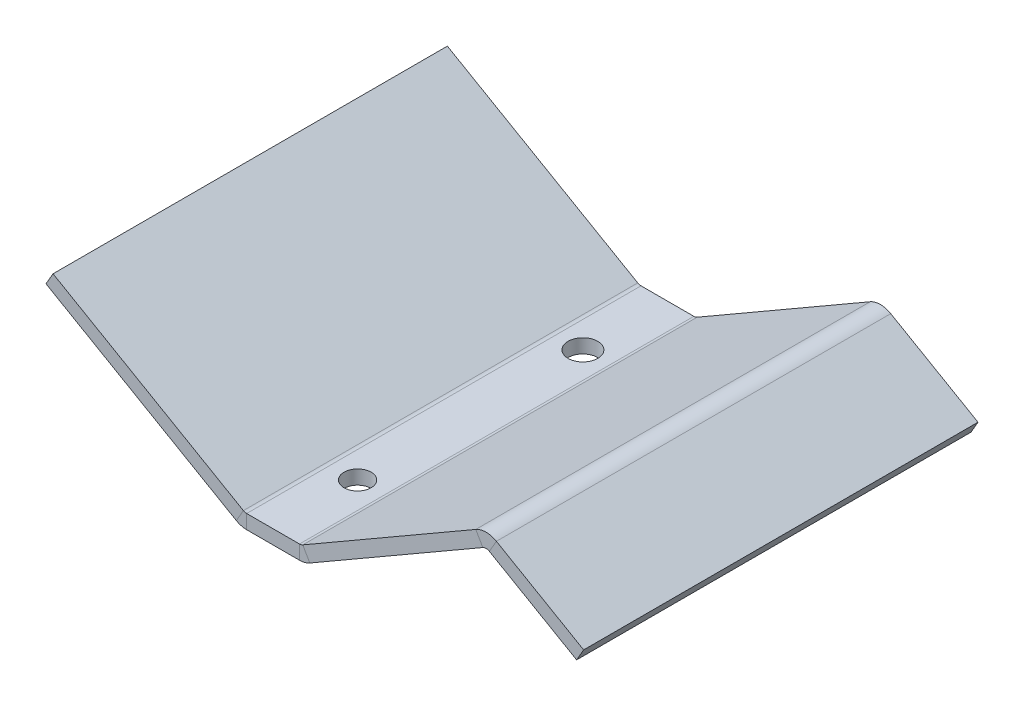
ISO-10303-21;
HEADER;
FILE_DESCRIPTION(('STEP AP214'),'2;1');
FILE_NAME('part.step','',(''),(''),'','','');
FILE_SCHEMA(('AUTOMOTIVE_DESIGN { 1 0 10303 214 1 1 1 1 }'));
ENDSEC;
DATA;
#1=APPLICATION_CONTEXT('core data for automotive mechanical design processes');
#2=APPLICATION_PROTOCOL_DEFINITION('international standard','automotive_design',2000,#1);
#3=PRODUCT_CONTEXT('',#1,'mechanical');
#4=PRODUCT('Part','Part','',(#3));
#5=PRODUCT_RELATED_PRODUCT_CATEGORY('part','',(#4));
#6=PRODUCT_DEFINITION_FORMATION('','',#4);
#7=PRODUCT_DEFINITION_CONTEXT('part definition',#1,'design');
#8=PRODUCT_DEFINITION('design','',#6,#7);
#9=PRODUCT_DEFINITION_SHAPE('','',#8);
#10=(LENGTH_UNIT() NAMED_UNIT(*) SI_UNIT(.MILLI.,.METRE.));
#11=(NAMED_UNIT(*) PLANE_ANGLE_UNIT() SI_UNIT($,.RADIAN.));
#12=(NAMED_UNIT(*) SI_UNIT($,.STERADIAN.) SOLID_ANGLE_UNIT());
#13=UNCERTAINTY_MEASURE_WITH_UNIT(LENGTH_MEASURE(1.E-05),#10,'distance_accuracy_value','');
#14=(GEOMETRIC_REPRESENTATION_CONTEXT(3) GLOBAL_UNCERTAINTY_ASSIGNED_CONTEXT((#13)) GLOBAL_UNIT_ASSIGNED_CONTEXT((#10,
#11,#12)) REPRESENTATION_CONTEXT('',''));
#15=CARTESIAN_POINT('',(0.,0.,0.));
#16=DIRECTION('',(0.,0.,1.));
#17=DIRECTION('',(1.,0.,0.));
#18=AXIS2_PLACEMENT_3D('',#15,#16,#17);
#19=CARTESIAN_POINT('',(10.31875,-1.3748153285078,44.45));
#20=DIRECTION('',(0.,0.,-1.));
#21=DIRECTION('',(1.,0.,0.));
#22=AXIS2_PLACEMENT_3D('',#19,#20,#21);
#23=PLANE('',#22);
#24=DIRECTION('',(-0.499999999999991,0.866025403784444,0.));
#25=VECTOR('',#24,1.);
#26=CARTESIAN_POINT('',(29.9916145991092,9.98331834351881,44.45));
#27=LINE('',#26,#25);
#28=CARTESIAN_POINT('',(29.9916145991092,9.98331834351881,44.45));
#29=VERTEX_POINT('',#28);
#30=CARTESIAN_POINT('',(29.1978645991092,11.3581336720266,44.45));
#31=VERTEX_POINT('',#30);
#32=EDGE_CURVE('E220',#29,#31,#27,.T.);
#33=ORIENTED_EDGE('',*,*,#32,.T.);
#34=DIRECTION('',(0.866025403784442,0.499999999999995,0.));
#35=VECTOR('',#34,1.);
#36=CARTESIAN_POINT('',(9.52499999999996,0.,44.45));
#37=LINE('',#36,#35);
#38=CARTESIAN_POINT('',(9.6959286248552,0.0986856875723842,44.45));
#39=VERTEX_POINT('',#38);
#40=EDGE_CURVE('E289',#39,#31,#37,.T.);
#41=ORIENTED_EDGE('',*,*,#40,.F.);
#42=DIRECTION('',(-0.499999999999995,0.866025403784442,0.));
#43=VECTOR('',#42,1.);
#44=CARTESIAN_POINT('',(9.6959286248552,0.0986856875723813,44.45));
#45=LINE('',#44,#43);
#46=CARTESIAN_POINT('',(10.4896786248552,-1.27612964093542,44.45));
#47=VERTEX_POINT('',#46);
#48=EDGE_CURVE('E295',#39,#47,#45,.F.);
#49=ORIENTED_EDGE('',*,*,#48,.T.);
#50=DIRECTION('',(-0.866025403784442,-0.499999999999995,0.));
#51=VECTOR('',#50,1.);
#52=CARTESIAN_POINT('',(0.793749999999893,-6.87407664253895,44.45));
#53=LINE('',#52,#51);
#54=EDGE_CURVE('E283',#47,#29,#53,.F.);
#55=ORIENTED_EDGE('',*,*,#54,.T.);
#56=EDGE_LOOP('',(#33,#41,#49,#55));
#57=FACE_BOUND('',#56,.T.);
#58=ADVANCED_FACE('F45',(#57),#23,.F.);
#59=CARTESIAN_POINT('',(31.9474145991092,11.1124999999999,0.));
#60=DIRECTION('',(0.,0.,1.));
#61=DIRECTION('',(-1.,0.,0.));
#62=AXIS2_PLACEMENT_3D('',#59,#60,#61);
#63=PLANE('',#62);
#64=DIRECTION('',(-0.499999999999991,0.866025403784444,0.));
#65=VECTOR('',#64,1.);
#66=CARTESIAN_POINT('',(29.9916145991092,9.98331834351881,0.));
#67=LINE('',#66,#65);
#68=CARTESIAN_POINT('',(29.9916145991092,9.98331834351882,0.));
#69=VERTEX_POINT('',#68);
#70=CARTESIAN_POINT('',(29.1978645991092,11.3581336720266,0.));
#71=VERTEX_POINT('',#70);
#72=EDGE_CURVE('E214',#69,#71,#67,.T.);
#73=ORIENTED_EDGE('',*,*,#72,.F.);
#74=DIRECTION('',(0.866025403784442,0.499999999999995,0.));
#75=VECTOR('',#74,1.);
#76=CARTESIAN_POINT('',(0.793749999999893,-6.87407664253895,0.));
#77=LINE('',#76,#75);
#78=CARTESIAN_POINT('',(10.4896786248552,-1.27612964093542,0.));
#79=VERTEX_POINT('',#78);
#80=EDGE_CURVE('E279',#69,#79,#77,.F.);
#81=ORIENTED_EDGE('',*,*,#80,.T.);
#82=DIRECTION('',(-0.499999999999995,0.866025403784442,0.));
#83=VECTOR('',#82,1.);
#84=CARTESIAN_POINT('',(10.4896786248552,-1.27612964093542,0.));
#85=LINE('',#84,#83);
#86=CARTESIAN_POINT('',(9.6959286248552,0.0986856875723809,0.));
#87=VERTEX_POINT('',#86);
#88=EDGE_CURVE('E276',#87,#79,#85,.F.);
#89=ORIENTED_EDGE('',*,*,#88,.F.);
#90=DIRECTION('',(-0.866025403784442,-0.499999999999995,0.));
#91=VECTOR('',#90,1.);
#92=CARTESIAN_POINT('',(31.1536645991092,12.4873153285077,0.));
#93=LINE('',#92,#91);
#94=EDGE_CURVE('E286',#71,#87,#93,.T.);
#95=ORIENTED_EDGE('',*,*,#94,.F.);
#96=EDGE_LOOP('',(#73,#81,#89,#95));
#97=FACE_BOUND('',#96,.T.);
#98=ADVANCED_FACE('F373',(#97),#63,.F.);
#99=CARTESIAN_POINT('',(0.793749999999893,-6.87407664253895,0.));
#100=DIRECTION('',(0.499999999999995,-0.866025403784442,0.));
#101=DIRECTION('',(0.866025403784442,0.499999999999995,0.));
#102=AXIS2_PLACEMENT_3D('',#99,#100,#101);
#103=PLANE('',#102);
#104=ORIENTED_EDGE('',*,*,#54,.F.);
#105=DIRECTION('',(0.,0.,1.));
#106=VECTOR('',#105,1.);
#107=CARTESIAN_POINT('',(10.4896786248552,-1.27612964093542,0.));
#108=LINE('',#107,#106);
#109=EDGE_CURVE('E292',#79,#47,#108,.T.);
#110=ORIENTED_EDGE('',*,*,#109,.F.);
#111=ORIENTED_EDGE('',*,*,#80,.F.);
#112=DIRECTION('',(0.,0.,-1.));
#113=VECTOR('',#112,1.);
#114=CARTESIAN_POINT('',(29.9916145991092,9.98331834351881,0.));
#115=LINE('',#114,#113);
#116=EDGE_CURVE('E217',#69,#29,#115,.F.);
#117=ORIENTED_EDGE('',*,*,#116,.T.);
#118=EDGE_LOOP('',(#104,#110,#111,#117));
#119=FACE_BOUND('',#118,.T.);
#120=ADVANCED_FACE('F414',(#119),#103,.T.);
#121=CARTESIAN_POINT('',(0.,-5.49926131403115,0.));
#122=DIRECTION('',(0.499999999999995,-0.866025403784442,0.));
#123=DIRECTION('',(0.866025403784442,0.499999999999995,0.));
#124=AXIS2_PLACEMENT_3D('',#121,#122,#123);
#125=PLANE('',#124);
#126=DIRECTION('',(0.,0.,-1.));
#127=VECTOR('',#126,1.);
#128=CARTESIAN_POINT('',(29.1978645991092,11.3581336720266,0.));
#129=LINE('',#128,#127);
#130=EDGE_CURVE('E208',#71,#31,#129,.F.);
#131=ORIENTED_EDGE('',*,*,#130,.F.);
#132=ORIENTED_EDGE('',*,*,#94,.T.);
#133=DIRECTION('',(0.,0.,-1.));
#134=VECTOR('',#133,1.);
#135=CARTESIAN_POINT('',(9.6959286248552,0.0986856875723811,0.));
#136=LINE('',#135,#134);
#137=EDGE_CURVE('E298',#87,#39,#136,.F.);
#138=ORIENTED_EDGE('',*,*,#137,.T.);
#139=ORIENTED_EDGE('',*,*,#40,.T.);
#140=EDGE_LOOP('',(#131,#132,#138,#139));
#141=FACE_BOUND('',#140,.T.);
#142=ADVANCED_FACE('F368',(#141),#125,.F.);
#143=CARTESIAN_POINT('',(0.,-1.5875,0.));
#144=DIRECTION('',(0.,-1.,0.));
#145=DIRECTION('',(0.,0.,1.));
#146=AXIS2_PLACEMENT_3D('',#143,#144,#145);
#147=PLANE('',#146);
#148=CARTESIAN_POINT('',(6.35,-1.5875,34.925));
#149=DIRECTION('',(0.,-1.,0.));
#150=DIRECTION('',(0.,0.,-1.));
#151=AXIS2_PLACEMENT_3D('',#148,#149,#150);
#152=CIRCLE('',#151,1.52597868617214);
#153=CARTESIAN_POINT('',(6.35,-1.5875,33.3990213138279));
#154=VERTEX_POINT('',#153);
#155=EDGE_CURVE('E207',#154,#154,#152,.T.);
#156=ORIENTED_EDGE('',*,*,#155,.F.);
#157=EDGE_LOOP('',(#156));
#158=FACE_BOUND('',#157,.T.);
#159=CARTESIAN_POINT('',(6.35,-1.5875,9.525));
#160=DIRECTION('',(0.,-1.,0.));
#161=DIRECTION('',(0.,0.,-1.));
#162=AXIS2_PLACEMENT_3D('',#159,#160,#161);
#163=CIRCLE('',#162,1.67296480499859);
#164=CARTESIAN_POINT('',(6.35,-1.5875,7.8520351950014));
#165=VERTEX_POINT('',#164);
#166=EDGE_CURVE('E728',#165,#165,#163,.T.);
#167=ORIENTED_EDGE('',*,*,#166,.F.);
#168=EDGE_LOOP('',(#167));
#169=FACE_BOUND('',#168,.T.);
#170=DIRECTION('',(1.,0.,0.));
#171=VECTOR('',#170,1.);
#172=CARTESIAN_POINT('',(0.,-1.5875,0.));
#173=LINE('',#172,#171);
#174=CARTESIAN_POINT('',(3.3723713751448,-1.5875,0.));
#175=VERTEX_POINT('',#174);
#176=CARTESIAN_POINT('',(9.3276286248552,-1.5875,0.));
#177=VERTEX_POINT('',#176);
#178=EDGE_CURVE('E54',#175,#177,#173,.T.);
#179=ORIENTED_EDGE('',*,*,#178,.T.);
#180=DIRECTION('',(0.,0.,1.));
#181=VECTOR('',#180,1.);
#182=CARTESIAN_POINT('',(9.3276286248552,-1.5875,44.45));
#183=LINE('',#182,#181);
#184=CARTESIAN_POINT('',(9.3276286248552,-1.5875,44.45));
#185=VERTEX_POINT('',#184);
#186=EDGE_CURVE('E303',#185,#177,#183,.F.);
#187=ORIENTED_EDGE('',*,*,#186,.F.);
#188=DIRECTION('',(-1.,0.,0.));
#189=VECTOR('',#188,1.);
#190=CARTESIAN_POINT('',(0.,-1.5875,44.45));
#191=LINE('',#190,#189);
#192=CARTESIAN_POINT('',(3.3723713751448,-1.5875,44.45));
#193=VERTEX_POINT('',#192);
#194=EDGE_CURVE('E11',#185,#193,#191,.T.);
#195=ORIENTED_EDGE('',*,*,#194,.T.);
#196=DIRECTION('',(0.,0.,-1.));
#197=VECTOR('',#196,1.);
#198=CARTESIAN_POINT('',(3.3723713751448,-1.5875,0.));
#199=LINE('',#198,#197);
#200=EDGE_CURVE('E257',#175,#193,#199,.F.);
#201=ORIENTED_EDGE('',*,*,#200,.F.);
#202=EDGE_LOOP('',(#179,#187,#195,#201));
#203=FACE_BOUND('',#202,.T.);
#204=ADVANCED_FACE('F354',(#158,#169,#203),#147,.T.);
#205=CARTESIAN_POINT('',(0.,0.,0.));
#206=DIRECTION('',(0.,-1.,0.));
#207=DIRECTION('',(0.,0.,1.));
#208=AXIS2_PLACEMENT_3D('',#205,#206,#207);
#209=PLANE('',#208);
#210=CARTESIAN_POINT('',(6.35,0.,34.925));
#211=DIRECTION('',(0.,-1.,0.));
#212=DIRECTION('',(0.,0.,-1.));
#213=AXIS2_PLACEMENT_3D('',#210,#211,#212);
#214=CIRCLE('',#213,1.52597868617214);
#215=CARTESIAN_POINT('',(6.35,0.,33.3990213138279));
#216=VERTEX_POINT('',#215);
#217=EDGE_CURVE('E723',#216,#216,#214,.T.);
#218=ORIENTED_EDGE('',*,*,#217,.T.);
#219=EDGE_LOOP('',(#218));
#220=FACE_BOUND('',#219,.T.);
#221=CARTESIAN_POINT('',(6.35,0.,9.525));
#222=DIRECTION('',(0.,-1.,0.));
#223=DIRECTION('',(0.,0.,-1.));
#224=AXIS2_PLACEMENT_3D('',#221,#222,#223);
#225=CIRCLE('',#224,1.67296480499859);
#226=CARTESIAN_POINT('',(6.35,0.,7.8520351950014));
#227=VERTEX_POINT('',#226);
#228=EDGE_CURVE('E724',#227,#227,#225,.T.);
#229=ORIENTED_EDGE('',*,*,#228,.T.);
#230=EDGE_LOOP('',(#229));
#231=FACE_BOUND('',#230,.T.);
#232=DIRECTION('',(0.,0.,-1.));
#233=VECTOR('',#232,1.);
#234=CARTESIAN_POINT('',(3.3723713751448,0.,0.));
#235=LINE('',#234,#233);
#236=CARTESIAN_POINT('',(3.3723713751448,0.,0.));
#237=VERTEX_POINT('',#236);
#238=CARTESIAN_POINT('',(3.3723713751448,0.,44.45));
#239=VERTEX_POINT('',#238);
#240=EDGE_CURVE('E269',#237,#239,#235,.F.);
#241=ORIENTED_EDGE('',*,*,#240,.T.);
#242=DIRECTION('',(-1.,0.,0.));
#243=VECTOR('',#242,1.);
#244=CARTESIAN_POINT('',(0.,0.,44.45));
#245=LINE('',#244,#243);
#246=CARTESIAN_POINT('',(9.3276286248552,0.,44.45));
#247=VERTEX_POINT('',#246);
#248=EDGE_CURVE('E49',#247,#239,#245,.T.);
#249=ORIENTED_EDGE('',*,*,#248,.F.);
#250=DIRECTION('',(0.,0.,1.));
#251=VECTOR('',#250,1.);
#252=CARTESIAN_POINT('',(9.3276286248552,0.,44.45));
#253=LINE('',#252,#251);
#254=CARTESIAN_POINT('',(9.3276286248552,0.,0.));
#255=VERTEX_POINT('',#254);
#256=EDGE_CURVE('E313',#247,#255,#253,.F.);
#257=ORIENTED_EDGE('',*,*,#256,.T.);
#258=DIRECTION('',(1.,0.,0.));
#259=VECTOR('',#258,1.);
#260=CARTESIAN_POINT('',(0.,0.,0.));
#261=LINE('',#260,#259);
#262=EDGE_CURVE('E320',#237,#255,#261,.T.);
#263=ORIENTED_EDGE('',*,*,#262,.F.);
#264=EDGE_LOOP('',(#241,#249,#257,#263));
#265=FACE_BOUND('',#264,.T.);
#266=ADVANCED_FACE('F338',(#220,#231,#265),#209,.F.);
#267=CARTESIAN_POINT('',(0.,-1.5875,0.));
#268=DIRECTION('',(0.,0.,-1.));
#269=DIRECTION('',(1.,0.,0.));
#270=AXIS2_PLACEMENT_3D('',#267,#268,#269);
#271=PLANE('',#270);
#272=ORIENTED_EDGE('',*,*,#262,.T.);
#273=DIRECTION('',(0.,-1.,0.));
#274=VECTOR('',#273,1.);
#275=CARTESIAN_POINT('',(9.3276286248552,0.,0.));
#276=LINE('',#275,#274);
#277=EDGE_CURVE('E317',#255,#177,#276,.T.);
#278=ORIENTED_EDGE('',*,*,#277,.T.);
#279=ORIENTED_EDGE('',*,*,#178,.F.);
#280=DIRECTION('',(0.,-1.,0.));
#281=VECTOR('',#280,1.);
#282=CARTESIAN_POINT('',(3.3723713751448,0.,0.));
#283=LINE('',#282,#281);
#284=EDGE_CURVE('E264',#237,#175,#283,.T.);
#285=ORIENTED_EDGE('',*,*,#284,.F.);
#286=EDGE_LOOP('',(#272,#278,#279,#285));
#287=FACE_BOUND('',#286,.T.);
#288=ADVANCED_FACE('F47',(#287),#271,.T.);
#289=CARTESIAN_POINT('',(0.,-1.5875,44.45));
#290=DIRECTION('',(0.,0.,1.));
#291=DIRECTION('',(-1.,0.,0.));
#292=AXIS2_PLACEMENT_3D('',#289,#290,#291);
#293=PLANE('',#292);
#294=DIRECTION('',(0.,-1.,0.));
#295=VECTOR('',#294,1.);
#296=CARTESIAN_POINT('',(3.3723713751448,0.,44.45));
#297=LINE('',#296,#295);
#298=EDGE_CURVE('E273',#239,#193,#297,.T.);
#299=ORIENTED_EDGE('',*,*,#298,.T.);
#300=ORIENTED_EDGE('',*,*,#194,.F.);
#301=DIRECTION('',(0.,-1.,0.));
#302=VECTOR('',#301,1.);
#303=CARTESIAN_POINT('',(9.3276286248552,0.,44.45));
#304=LINE('',#303,#302);
#305=EDGE_CURVE('E309',#247,#185,#304,.T.);
#306=ORIENTED_EDGE('',*,*,#305,.F.);
#307=ORIENTED_EDGE('',*,*,#248,.T.);
#308=EDGE_LOOP('',(#299,#300,#306,#307));
#309=FACE_BOUND('',#308,.T.);
#310=ADVANCED_FACE('F332',(#309),#293,.T.);
#311=CARTESIAN_POINT('',(9.3276286248552,0.7366,0.));
#312=DIRECTION('',(0.,0.,-1.));
#313=DIRECTION('',(0.,-1.,0.));
#314=AXIS2_PLACEMENT_3D('',#311,#312,#313);
#315=PLANE('',#314);
#316=ORIENTED_EDGE('',*,*,#88,.T.);
#317=CARTESIAN_POINT('',(9.3276286248552,0.7366,0.));
#318=DIRECTION('',(0.,0.,-1.));
#319=DIRECTION('',(0.,1.,0.));
#320=AXIS2_PLACEMENT_3D('',#317,#318,#319);
#321=CIRCLE('',#320,2.3241);
#322=EDGE_CURVE('E306',#177,#79,#321,.F.);
#323=ORIENTED_EDGE('',*,*,#322,.F.);
#324=ORIENTED_EDGE('',*,*,#277,.F.);
#325=CARTESIAN_POINT('',(9.3276286248552,0.7366,0.));
#326=DIRECTION('',(0.,0.,-1.));
#327=DIRECTION('',(0.,1.,0.));
#328=AXIS2_PLACEMENT_3D('',#325,#326,#327);
#329=CIRCLE('',#328,0.7366);
#330=EDGE_CURVE('E311',#255,#87,#329,.F.);
#331=ORIENTED_EDGE('',*,*,#330,.T.);
#332=EDGE_LOOP('',(#316,#323,#324,#331));
#333=FACE_BOUND('',#332,.T.);
#334=ADVANCED_FACE('F376',(#333),#315,.T.);
#335=CARTESIAN_POINT('',(9.3276286248552,0.736600000000004,44.45));
#336=DIRECTION('',(0.,0.,-1.));
#337=DIRECTION('',(0.,-1.,0.));
#338=AXIS2_PLACEMENT_3D('',#335,#336,#337);
#339=PLANE('',#338);
#340=CARTESIAN_POINT('',(9.3276286248552,0.736600000000004,44.45));
#341=DIRECTION('',(0.,0.,-1.));
#342=DIRECTION('',(0.,1.,0.));
#343=AXIS2_PLACEMENT_3D('',#340,#341,#342);
#344=CIRCLE('',#343,0.7366);
#345=EDGE_CURVE('E282',#39,#247,#344,.T.);
#346=ORIENTED_EDGE('',*,*,#345,.T.);
#347=ORIENTED_EDGE('',*,*,#305,.T.);
#348=CARTESIAN_POINT('',(9.3276286248552,0.736600000000004,44.45));
#349=DIRECTION('',(0.,0.,-1.));
#350=DIRECTION('',(0.,1.,0.));
#351=AXIS2_PLACEMENT_3D('',#348,#349,#350);
#352=CIRCLE('',#351,2.3241);
#353=EDGE_CURVE('E307',#47,#185,#352,.T.);
#354=ORIENTED_EDGE('',*,*,#353,.F.);
#355=ORIENTED_EDGE('',*,*,#48,.F.);
#356=EDGE_LOOP('',(#346,#347,#354,#355));
#357=FACE_BOUND('',#356,.T.);
#358=ADVANCED_FACE('F361',(#357),#339,.F.);
#359=CARTESIAN_POINT('',(9.3276286248552,0.736600000000004,44.45));
#360=DIRECTION('',(0.,0.,1.));
#361=DIRECTION('',(0.499999999999995,-0.866025403784442,0.));
#362=AXIS2_PLACEMENT_3D('',#359,#360,#361);
#363=CYLINDRICAL_SURFACE('',#362,2.3241);
#364=ORIENTED_EDGE('',*,*,#186,.T.);
#365=ORIENTED_EDGE('',*,*,#322,.T.);
#366=ORIENTED_EDGE('',*,*,#109,.T.);
#367=ORIENTED_EDGE('',*,*,#353,.T.);
#368=EDGE_LOOP('',(#364,#365,#366,#367));
#369=FACE_BOUND('',#368,.T.);
#370=ADVANCED_FACE('F356',(#369),#363,.T.);
#371=CARTESIAN_POINT('',(9.3276286248552,0.736600000000004,44.45));
#372=DIRECTION('',(0.,0.,1.));
#373=DIRECTION('',(0.499999999999995,-0.866025403784442,0.));
#374=AXIS2_PLACEMENT_3D('',#371,#372,#373);
#375=CYLINDRICAL_SURFACE('',#374,0.7366);
#376=ORIENTED_EDGE('',*,*,#256,.F.);
#377=ORIENTED_EDGE('',*,*,#345,.F.);
#378=ORIENTED_EDGE('',*,*,#137,.F.);
#379=ORIENTED_EDGE('',*,*,#330,.F.);
#380=EDGE_LOOP('',(#376,#377,#378,#379));
#381=FACE_BOUND('',#380,.T.);
#382=ADVANCED_FACE('F365',(#381),#375,.F.);
#383=CARTESIAN_POINT('',(3.3723713751448,0.7366,44.45));
#384=DIRECTION('',(0.,0.,1.));
#385=DIRECTION('',(0.,1.,0.));
#386=AXIS2_PLACEMENT_3D('',#383,#384,#385);
#387=PLANE('',#386);
#388=DIRECTION('',(0.499999999999995,0.866025403784442,0.));
#389=VECTOR('',#388,1.);
#390=CARTESIAN_POINT('',(2.21032137514481,-1.27612964093542,44.45));
#391=LINE('',#390,#389);
#392=CARTESIAN_POINT('',(3.0040713751448,0.0986856875723812,44.45));
#393=VERTEX_POINT('',#392);
#394=CARTESIAN_POINT('',(2.21032137514481,-1.27612964093542,44.45));
#395=VERTEX_POINT('',#394);
#396=EDGE_CURVE('E223',#393,#395,#391,.F.);
#397=ORIENTED_EDGE('',*,*,#396,.T.);
#398=CARTESIAN_POINT('',(3.3723713751448,0.7366,44.45));
#399=DIRECTION('',(0.,0.,1.));
#400=DIRECTION('',(0.,-1.,0.));
#401=AXIS2_PLACEMENT_3D('',#398,#399,#400);
#402=CIRCLE('',#401,2.3241);
#403=EDGE_CURVE('E260',#193,#395,#402,.F.);
#404=ORIENTED_EDGE('',*,*,#403,.F.);
#405=ORIENTED_EDGE('',*,*,#298,.F.);
#406=CARTESIAN_POINT('',(3.3723713751448,0.7366,44.45));
#407=DIRECTION('',(0.,0.,1.));
#408=DIRECTION('',(0.,-1.,0.));
#409=AXIS2_PLACEMENT_3D('',#406,#407,#408);
#410=CIRCLE('',#409,0.736599999999999);
#411=EDGE_CURVE('E266',#239,#393,#410,.F.);
#412=ORIENTED_EDGE('',*,*,#411,.T.);
#413=EDGE_LOOP('',(#397,#404,#405,#412));
#414=FACE_BOUND('',#413,.T.);
#415=ADVANCED_FACE('F345',(#414),#387,.T.);
#416=CARTESIAN_POINT('',(3.3723713751448,0.736600000000003,0.));
#417=DIRECTION('',(0.,0.,1.));
#418=DIRECTION('',(0.,1.,0.));
#419=AXIS2_PLACEMENT_3D('',#416,#417,#418);
#420=PLANE('',#419);
#421=CARTESIAN_POINT('',(3.3723713751448,0.736600000000003,0.));
#422=DIRECTION('',(0.,0.,1.));
#423=DIRECTION('',(0.,-1.,0.));
#424=AXIS2_PLACEMENT_3D('',#421,#422,#423);
#425=CIRCLE('',#424,0.736599999999999);
#426=CARTESIAN_POINT('',(3.0040713751448,0.0986856875723845,0.));
#427=VERTEX_POINT('',#426);
#428=EDGE_CURVE('E228',#427,#237,#425,.T.);
#429=ORIENTED_EDGE('',*,*,#428,.T.);
#430=ORIENTED_EDGE('',*,*,#284,.T.);
#431=CARTESIAN_POINT('',(3.3723713751448,0.736600000000003,0.));
#432=DIRECTION('',(0.,0.,1.));
#433=DIRECTION('',(0.,-1.,0.));
#434=AXIS2_PLACEMENT_3D('',#431,#432,#433);
#435=CIRCLE('',#434,2.3241);
#436=CARTESIAN_POINT('',(2.21032137514481,-1.27612964093542,0.));
#437=VERTEX_POINT('',#436);
#438=EDGE_CURVE('E261',#437,#175,#435,.T.);
#439=ORIENTED_EDGE('',*,*,#438,.F.);
#440=DIRECTION('',(0.499999999999995,0.866025403784442,0.));
#441=VECTOR('',#440,1.);
#442=CARTESIAN_POINT('',(3.0040713751448,0.0986856875723803,0.));
#443=LINE('',#442,#441);
#444=EDGE_CURVE('E249',#427,#437,#443,.F.);
#445=ORIENTED_EDGE('',*,*,#444,.F.);
#446=EDGE_LOOP('',(#429,#430,#439,#445));
#447=FACE_BOUND('',#446,.T.);
#448=ADVANCED_FACE('F379',(#447),#420,.F.);
#449=CARTESIAN_POINT('',(3.3723713751448,0.736600000000003,0.));
#450=DIRECTION('',(0.,0.,-1.));
#451=DIRECTION('',(-0.499999999999995,-0.866025403784442,0.));
#452=AXIS2_PLACEMENT_3D('',#449,#450,#451);
#453=CYLINDRICAL_SURFACE('',#452,2.3241);
#454=ORIENTED_EDGE('',*,*,#200,.T.);
#455=ORIENTED_EDGE('',*,*,#403,.T.);
#456=DIRECTION('',(0.,0.,-1.));
#457=VECTOR('',#456,1.);
#458=CARTESIAN_POINT('',(2.21032137514481,-1.27612964093542,44.45));
#459=LINE('',#458,#457);
#460=EDGE_CURVE('E246',#437,#395,#459,.F.);
#461=ORIENTED_EDGE('',*,*,#460,.F.);
#462=ORIENTED_EDGE('',*,*,#438,.T.);
#463=EDGE_LOOP('',(#454,#455,#461,#462));
#464=FACE_BOUND('',#463,.T.);
#465=ADVANCED_FACE('F348',(#464),#453,.T.);
#466=CARTESIAN_POINT('',(3.3723713751448,0.736600000000003,0.));
#467=DIRECTION('',(0.,0.,-1.));
#468=DIRECTION('',(-0.499999999999995,-0.866025403784442,0.));
#469=AXIS2_PLACEMENT_3D('',#466,#467,#468);
#470=CYLINDRICAL_SURFACE('',#469,0.736599999999999);
#471=ORIENTED_EDGE('',*,*,#240,.F.);
#472=ORIENTED_EDGE('',*,*,#428,.F.);
#473=DIRECTION('',(0.,0.,-1.));
#474=VECTOR('',#473,1.);
#475=CARTESIAN_POINT('',(3.0040713751448,0.0986856875723818,44.45));
#476=LINE('',#475,#474);
#477=EDGE_CURVE('E252',#393,#427,#476,.T.);
#478=ORIENTED_EDGE('',*,*,#477,.F.);
#479=ORIENTED_EDGE('',*,*,#411,.F.);
#480=EDGE_LOOP('',(#471,#472,#478,#479));
#481=FACE_BOUND('',#480,.T.);
#482=ADVANCED_FACE('F341',(#481),#470,.F.);
#483=CARTESIAN_POINT('',(-19.2474145991092,11.1124999999999,0.));
#484=DIRECTION('',(0.,0.,1.));
#485=DIRECTION('',(-1.,0.,0.));
#486=AXIS2_PLACEMENT_3D('',#483,#484,#485);
#487=PLANE('',#486);
#488=ORIENTED_EDGE('',*,*,#444,.T.);
#489=DIRECTION('',(-0.866025403784442,0.499999999999995,0.));
#490=VECTOR('',#489,1.);
#491=CARTESIAN_POINT('',(2.38125000000004,-1.3748153285078,0.));
#492=LINE('',#491,#490);
#493=CARTESIAN_POINT('',(-19.2474145991092,11.1124999999999,0.));
#494=VERTEX_POINT('',#493);
#495=EDGE_CURVE('E236',#437,#494,#492,.T.);
#496=ORIENTED_EDGE('',*,*,#495,.T.);
#497=DIRECTION('',(0.499999999999995,0.866025403784442,0.));
#498=VECTOR('',#497,1.);
#499=CARTESIAN_POINT('',(-19.2474145991092,11.1124999999999,0.));
#500=LINE('',#499,#498);
#501=CARTESIAN_POINT('',(-18.4536645991092,12.4873153285077,0.));
#502=VERTEX_POINT('',#501);
#503=EDGE_CURVE('E225',#494,#502,#500,.T.);
#504=ORIENTED_EDGE('',*,*,#503,.T.);
#505=DIRECTION('',(0.866025403784442,-0.499999999999995,0.));
#506=VECTOR('',#505,1.);
#507=CARTESIAN_POINT('',(-18.4536645991092,12.4873153285077,0.));
#508=LINE('',#507,#506);
#509=EDGE_CURVE('E243',#427,#502,#508,.F.);
#510=ORIENTED_EDGE('',*,*,#509,.F.);
#511=EDGE_LOOP('',(#488,#496,#504,#510));
#512=FACE_BOUND('',#511,.T.);
#513=ADVANCED_FACE('F382',(#512),#487,.F.);
#514=CARTESIAN_POINT('',(2.38125000000004,-1.3748153285078,44.45));
#515=DIRECTION('',(0.,0.,-1.));
#516=DIRECTION('',(1.,0.,0.));
#517=AXIS2_PLACEMENT_3D('',#514,#515,#516);
#518=PLANE('',#517);
#519=ORIENTED_EDGE('',*,*,#396,.F.);
#520=DIRECTION('',(-0.866025403784442,0.499999999999995,0.));
#521=VECTOR('',#520,1.);
#522=CARTESIAN_POINT('',(3.17500000000003,0.,44.45));
#523=LINE('',#522,#521);
#524=CARTESIAN_POINT('',(-18.4536645991092,12.4873153285077,44.45));
#525=VERTEX_POINT('',#524);
#526=EDGE_CURVE('E239',#525,#393,#523,.F.);
#527=ORIENTED_EDGE('',*,*,#526,.F.);
#528=DIRECTION('',(0.499999999999995,0.866025403784442,0.));
#529=VECTOR('',#528,1.);
#530=CARTESIAN_POINT('',(-19.2474145991092,11.1124999999999,44.45));
#531=LINE('',#530,#529);
#532=CARTESIAN_POINT('',(-19.2474145991092,11.1124999999999,44.45));
#533=VERTEX_POINT('',#532);
#534=EDGE_CURVE('E229',#533,#525,#531,.T.);
#535=ORIENTED_EDGE('',*,*,#534,.F.);
#536=DIRECTION('',(0.866025403784442,-0.499999999999995,0.));
#537=VECTOR('',#536,1.);
#538=CARTESIAN_POINT('',(2.38125000000004,-1.3748153285078,44.45));
#539=LINE('',#538,#537);
#540=EDGE_CURVE('E232',#533,#395,#539,.T.);
#541=ORIENTED_EDGE('',*,*,#540,.T.);
#542=EDGE_LOOP('',(#519,#527,#535,#541));
#543=FACE_BOUND('',#542,.T.);
#544=ADVANCED_FACE('F389',(#543),#518,.F.);
#545=CARTESIAN_POINT('',(2.38125000000004,-1.3748153285078,0.));
#546=DIRECTION('',(0.499999999999995,0.866025403784442,0.));
#547=DIRECTION('',(-0.866025403784442,0.499999999999995,0.));
#548=AXIS2_PLACEMENT_3D('',#545,#546,#547);
#549=PLANE('',#548);
#550=ORIENTED_EDGE('',*,*,#460,.T.);
#551=ORIENTED_EDGE('',*,*,#540,.F.);
#552=DIRECTION('',(0.,0.,1.));
#553=VECTOR('',#552,1.);
#554=CARTESIAN_POINT('',(-19.2474145991092,11.1124999999999,0.));
#555=LINE('',#554,#553);
#556=EDGE_CURVE('E234',#494,#533,#555,.T.);
#557=ORIENTED_EDGE('',*,*,#556,.F.);
#558=ORIENTED_EDGE('',*,*,#495,.F.);
#559=EDGE_LOOP('',(#550,#551,#557,#558));
#560=FACE_BOUND('',#559,.T.);
#561=ADVANCED_FACE('F392',(#560),#549,.F.);
#562=CARTESIAN_POINT('',(3.17500000000003,0.,0.));
#563=DIRECTION('',(0.499999999999995,0.866025403784442,0.));
#564=DIRECTION('',(-0.866025403784442,0.499999999999995,0.));
#565=AXIS2_PLACEMENT_3D('',#562,#563,#564);
#566=PLANE('',#565);
#567=ORIENTED_EDGE('',*,*,#509,.T.);
#568=DIRECTION('',(0.,0.,-1.));
#569=VECTOR('',#568,1.);
#570=CARTESIAN_POINT('',(-18.4536645991092,12.4873153285077,44.45));
#571=LINE('',#570,#569);
#572=EDGE_CURVE('E241',#502,#525,#571,.F.);
#573=ORIENTED_EDGE('',*,*,#572,.T.);
#574=ORIENTED_EDGE('',*,*,#526,.T.);
#575=ORIENTED_EDGE('',*,*,#477,.T.);
#576=EDGE_LOOP('',(#567,#573,#574,#575));
#577=FACE_BOUND('',#576,.T.);
#578=ADVANCED_FACE('F385',(#577),#566,.T.);
#579=CARTESIAN_POINT('',(-19.2474145991092,11.1124999999999,44.45));
#580=DIRECTION('',(0.866025403784442,-0.499999999999995,0.));
#581=DIRECTION('',(0.499999999999995,0.866025403784442,0.));
#582=AXIS2_PLACEMENT_3D('',#579,#580,#581);
#583=PLANE('',#582);
#584=ORIENTED_EDGE('',*,*,#572,.F.);
#585=ORIENTED_EDGE('',*,*,#503,.F.);
#586=ORIENTED_EDGE('',*,*,#556,.T.);
#587=ORIENTED_EDGE('',*,*,#534,.T.);
#588=EDGE_LOOP('',(#584,#585,#586,#587));
#589=FACE_BOUND('',#588,.T.);
#590=ADVANCED_FACE('F394',(#589),#583,.F.);
#591=CARTESIAN_POINT('',(30.3599145991092,9.34540403109119,44.45));
#592=DIRECTION('',(0.,0.,1.));
#593=DIRECTION('',(-1.,0.,0.));
#594=AXIS2_PLACEMENT_3D('',#591,#592,#593);
#595=PLANE('',#594);
#596=DIRECTION('',(-0.500000000000001,-0.866025403784438,0.));
#597=VECTOR('',#596,1.);
#598=CARTESIAN_POINT('',(31.5219645991092,11.3581336720266,44.45));
#599=LINE('',#598,#597);
#600=CARTESIAN_POINT('',(30.7282145991092,9.98331834351881,44.45));
#601=VERTEX_POINT('',#600);
#602=CARTESIAN_POINT('',(31.5219645991092,11.3581336720266,44.45));
#603=VERTEX_POINT('',#602);
#604=EDGE_CURVE('E204',#601,#603,#599,.F.);
#605=ORIENTED_EDGE('',*,*,#604,.T.);
#606=CARTESIAN_POINT('',(30.3599145991092,9.34540403109119,44.45));
#607=DIRECTION('',(0.,0.,1.));
#608=DIRECTION('',(1.,0.,0.));
#609=AXIS2_PLACEMENT_3D('',#606,#607,#608);
#610=CIRCLE('',#609,2.3241);
#611=EDGE_CURVE('E211',#31,#603,#610,.F.);
#612=ORIENTED_EDGE('',*,*,#611,.F.);
#613=ORIENTED_EDGE('',*,*,#32,.F.);
#614=CARTESIAN_POINT('',(30.3599145991092,9.34540403109119,44.45));
#615=DIRECTION('',(0.,0.,1.));
#616=DIRECTION('',(1.,0.,0.));
#617=AXIS2_PLACEMENT_3D('',#614,#615,#616);
#618=CIRCLE('',#617,0.736600000000003);
#619=EDGE_CURVE('E62',#29,#601,#618,.F.);
#620=ORIENTED_EDGE('',*,*,#619,.T.);
#621=EDGE_LOOP('',(#605,#612,#613,#620));
#622=FACE_BOUND('',#621,.T.);
#623=ADVANCED_FACE('F396',(#622),#595,.T.);
#624=CARTESIAN_POINT('',(30.3599145991092,9.34540403109119,0.));
#625=DIRECTION('',(0.,0.,1.));
#626=DIRECTION('',(-1.,0.,0.));
#627=AXIS2_PLACEMENT_3D('',#624,#625,#626);
#628=PLANE('',#627);
#629=CARTESIAN_POINT('',(30.3599145991092,9.34540403109119,0.));
#630=DIRECTION('',(0.,0.,1.));
#631=DIRECTION('',(1.,0.,0.));
#632=AXIS2_PLACEMENT_3D('',#629,#630,#631);
#633=CIRCLE('',#632,0.736600000000003);
#634=CARTESIAN_POINT('',(30.7282145991092,9.98331834351881,0.));
#635=VERTEX_POINT('',#634);
#636=EDGE_CURVE('E70',#635,#69,#633,.T.);
#637=ORIENTED_EDGE('',*,*,#636,.T.);
#638=ORIENTED_EDGE('',*,*,#72,.T.);
#639=CARTESIAN_POINT('',(30.3599145991092,9.34540403109119,0.));
#640=DIRECTION('',(0.,0.,1.));
#641=DIRECTION('',(1.,0.,0.));
#642=AXIS2_PLACEMENT_3D('',#639,#640,#641);
#643=CIRCLE('',#642,2.3241);
#644=CARTESIAN_POINT('',(31.5219645991092,11.3581336720266,0.));
#645=VERTEX_POINT('',#644);
#646=EDGE_CURVE('E212',#645,#71,#643,.T.);
#647=ORIENTED_EDGE('',*,*,#646,.F.);
#648=DIRECTION('',(-0.500000000000001,-0.866025403784438,0.));
#649=VECTOR('',#648,1.);
#650=CARTESIAN_POINT('',(30.7282145991092,9.98331834351881,0.));
#651=LINE('',#650,#649);
#652=EDGE_CURVE('E198',#635,#645,#651,.F.);
#653=ORIENTED_EDGE('',*,*,#652,.F.);
#654=EDGE_LOOP('',(#637,#638,#647,#653));
#655=FACE_BOUND('',#654,.T.);
#656=ADVANCED_FACE('F402',(#655),#628,.F.);
#657=CARTESIAN_POINT('',(30.3599145991092,9.34540403109119,0.));
#658=DIRECTION('',(0.,0.,-1.));
#659=DIRECTION('',(0.500000000000001,0.866025403784438,0.));
#660=AXIS2_PLACEMENT_3D('',#657,#658,#659);
#661=CYLINDRICAL_SURFACE('',#660,2.3241);
#662=ORIENTED_EDGE('',*,*,#130,.T.);
#663=ORIENTED_EDGE('',*,*,#611,.T.);
#664=DIRECTION('',(0.,0.,-1.));
#665=VECTOR('',#664,1.);
#666=CARTESIAN_POINT('',(31.5219645991092,11.3581336720266,44.45));
#667=LINE('',#666,#665);
#668=EDGE_CURVE('E179',#645,#603,#667,.F.);
#669=ORIENTED_EDGE('',*,*,#668,.F.);
#670=ORIENTED_EDGE('',*,*,#646,.T.);
#671=EDGE_LOOP('',(#662,#663,#669,#670));
#672=FACE_BOUND('',#671,.T.);
#673=ADVANCED_FACE('F612',(#672),#661,.T.);
#674=CARTESIAN_POINT('',(30.3599145991092,9.34540403109119,0.));
#675=DIRECTION('',(0.,0.,-1.));
#676=DIRECTION('',(0.500000000000001,0.866025403784438,0.));
#677=AXIS2_PLACEMENT_3D('',#674,#675,#676);
#678=CYLINDRICAL_SURFACE('',#677,0.736600000000003);
#679=ORIENTED_EDGE('',*,*,#116,.F.);
#680=ORIENTED_EDGE('',*,*,#636,.F.);
#681=DIRECTION('',(0.,0.,-1.));
#682=VECTOR('',#681,1.);
#683=CARTESIAN_POINT('',(30.7282145991092,9.98331834351881,44.45));
#684=LINE('',#683,#682);
#685=EDGE_CURVE('E201',#601,#635,#684,.T.);
#686=ORIENTED_EDGE('',*,*,#685,.F.);
#687=ORIENTED_EDGE('',*,*,#619,.F.);
#688=EDGE_LOOP('',(#679,#680,#686,#687));
#689=FACE_BOUND('',#688,.T.);
#690=ADVANCED_FACE('F622',(#689),#678,.F.);
#691=CARTESIAN_POINT('',(41.3584372271715,5.67904355233839,0.));
#692=DIRECTION('',(0.,0.,1.));
#693=DIRECTION('',(-1.,0.,0.));
#694=AXIS2_PLACEMENT_3D('',#691,#692,#693);
#695=PLANE('',#694);
#696=ORIENTED_EDGE('',*,*,#652,.T.);
#697=DIRECTION('',(0.866025403784438,-0.500000000000001,0.));
#698=VECTOR('',#697,1.);
#699=CARTESIAN_POINT('',(12.0049572995546,22.6262830902004,0.));
#700=LINE('',#699,#698);
#701=CARTESIAN_POINT('',(41.3584372271716,5.6790435523384,0.));
#702=VERTEX_POINT('',#701);
#703=EDGE_CURVE('E174',#645,#702,#700,.T.);
#704=ORIENTED_EDGE('',*,*,#703,.T.);
#705=DIRECTION('',(-0.500000000000001,-0.866025403784438,0.));
#706=VECTOR('',#705,1.);
#707=CARTESIAN_POINT('',(41.3584372271715,5.67904355233839,0.));
#708=LINE('',#707,#706);
#709=CARTESIAN_POINT('',(40.5646872271716,4.3042282238306,0.));
#710=VERTEX_POINT('',#709);
#711=EDGE_CURVE('E170',#702,#710,#708,.T.);
#712=ORIENTED_EDGE('',*,*,#711,.T.);
#713=DIRECTION('',(-0.866025403784438,0.500000000000001,0.));
#714=VECTOR('',#713,1.);
#715=CARTESIAN_POINT('',(40.5646872271716,4.3042282238306,0.));
#716=LINE('',#715,#714);
#717=EDGE_CURVE('E194',#635,#710,#716,.F.);
#718=ORIENTED_EDGE('',*,*,#717,.F.);
#719=EDGE_LOOP('',(#696,#704,#712,#718));
#720=FACE_BOUND('',#719,.T.);
#721=ADVANCED_FACE('F633',(#720),#695,.F.);
#722=CARTESIAN_POINT('',(31.1536645991092,11.5707717761691,44.45));
#723=DIRECTION('',(0.,0.,-1.));
#724=DIRECTION('',(1.,0.,0.));
#725=AXIS2_PLACEMENT_3D('',#722,#723,#724);
#726=PLANE('',#725);
#727=ORIENTED_EDGE('',*,*,#604,.F.);
#728=DIRECTION('',(0.866025403784438,-0.500000000000001,0.));
#729=VECTOR('',#728,1.);
#730=CARTESIAN_POINT('',(30.3599145991092,10.1959564476614,44.45));
#731=LINE('',#730,#729);
#732=CARTESIAN_POINT('',(40.5646872271716,4.3042282238306,44.45));
#733=VERTEX_POINT('',#732);
#734=EDGE_CURVE('E185',#733,#601,#731,.F.);
#735=ORIENTED_EDGE('',*,*,#734,.F.);
#736=DIRECTION('',(-0.500000000000001,-0.866025403784438,0.));
#737=VECTOR('',#736,1.);
#738=CARTESIAN_POINT('',(41.3584372271715,5.67904355233839,44.45));
#739=LINE('',#738,#737);
#740=CARTESIAN_POINT('',(41.3584372271715,5.6790435523384,44.45));
#741=VERTEX_POINT('',#740);
#742=EDGE_CURVE('E167',#741,#733,#739,.T.);
#743=ORIENTED_EDGE('',*,*,#742,.F.);
#744=DIRECTION('',(-0.866025403784438,0.500000000000001,0.));
#745=VECTOR('',#744,1.);
#746=CARTESIAN_POINT('',(12.0049572995546,22.6262830902004,44.45));
#747=LINE('',#746,#745);
#748=EDGE_CURVE('E173',#741,#603,#747,.T.);
#749=ORIENTED_EDGE('',*,*,#748,.T.);
#750=EDGE_LOOP('',(#727,#735,#743,#749));
#751=FACE_BOUND('',#750,.T.);
#752=ADVANCED_FACE('F184',(#751),#726,.F.);
#753=CARTESIAN_POINT('',(12.0049572995546,22.6262830902004,0.));
#754=DIRECTION('',(-0.500000000000001,-0.866025403784438,0.));
#755=DIRECTION('',(0.866025403784438,-0.500000000000001,0.));
#756=AXIS2_PLACEMENT_3D('',#753,#754,#755);
#757=PLANE('',#756);
#758=ORIENTED_EDGE('',*,*,#668,.T.);
#759=ORIENTED_EDGE('',*,*,#748,.F.);
#760=DIRECTION('',(0.,0.,1.));
#761=VECTOR('',#760,1.);
#762=CARTESIAN_POINT('',(41.3584372271716,5.6790435523384,0.));
#763=LINE('',#762,#761);
#764=EDGE_CURVE('E163',#702,#741,#763,.T.);
#765=ORIENTED_EDGE('',*,*,#764,.F.);
#766=ORIENTED_EDGE('',*,*,#703,.F.);
#767=EDGE_LOOP('',(#758,#759,#765,#766));
#768=FACE_BOUND('',#767,.T.);
#769=ADVANCED_FACE('F177',(#768),#757,.F.);
#770=CARTESIAN_POINT('',(11.2112072995546,21.2514677616926,0.));
#771=DIRECTION('',(-0.500000000000001,-0.866025403784438,0.));
#772=DIRECTION('',(0.866025403784438,-0.500000000000001,0.));
#773=AXIS2_PLACEMENT_3D('',#770,#771,#772);
#774=PLANE('',#773);
#775=ORIENTED_EDGE('',*,*,#717,.T.);
#776=DIRECTION('',(0.,0.,-1.));
#777=VECTOR('',#776,1.);
#778=CARTESIAN_POINT('',(40.5646872271716,4.3042282238306,44.45));
#779=LINE('',#778,#777);
#780=EDGE_CURVE('E192',#710,#733,#779,.F.);
#781=ORIENTED_EDGE('',*,*,#780,.T.);
#782=ORIENTED_EDGE('',*,*,#734,.T.);
#783=ORIENTED_EDGE('',*,*,#685,.T.);
#784=EDGE_LOOP('',(#775,#781,#782,#783));
#785=FACE_BOUND('',#784,.T.);
#786=ADVANCED_FACE('F662',(#785),#774,.T.);
#787=CARTESIAN_POINT('',(41.3584372271715,5.67904355233839,44.45));
#788=DIRECTION('',(-0.866025403784438,0.500000000000001,0.));
#789=DIRECTION('',(-0.500000000000001,-0.866025403784438,0.));
#790=AXIS2_PLACEMENT_3D('',#787,#788,#789);
#791=PLANE('',#790);
#792=ORIENTED_EDGE('',*,*,#780,.F.);
#793=ORIENTED_EDGE('',*,*,#711,.F.);
#794=ORIENTED_EDGE('',*,*,#764,.T.);
#795=ORIENTED_EDGE('',*,*,#742,.T.);
#796=EDGE_LOOP('',(#792,#793,#794,#795));
#797=FACE_BOUND('',#796,.T.);
#798=ADVANCED_FACE('F165',(#797),#791,.F.);
#799=CARTESIAN_POINT('',(6.35,-1.5875,9.525));
#800=DIRECTION('',(0.,1.,0.));
#801=DIRECTION('',(0.,0.,-1.));
#802=AXIS2_PLACEMENT_3D('',#799,#800,#801);
#803=CYLINDRICAL_SURFACE('',#802,1.67296480499859);
#804=ORIENTED_EDGE('',*,*,#166,.T.);
#805=EDGE_LOOP('',(#804));
#806=FACE_BOUND('',#805,.T.);
#807=ORIENTED_EDGE('',*,*,#228,.F.);
#808=EDGE_LOOP('',(#807));
#809=FACE_BOUND('',#808,.T.);
#810=ADVANCED_FACE('F682',(#806,#809),#803,.F.);
#811=CARTESIAN_POINT('',(6.35,-1.5875,34.925));
#812=DIRECTION('',(0.,1.,0.));
#813=DIRECTION('',(0.,0.,-1.));
#814=AXIS2_PLACEMENT_3D('',#811,#812,#813);
#815=CYLINDRICAL_SURFACE('',#814,1.52597868617214);
#816=ORIENTED_EDGE('',*,*,#155,.T.);
#817=EDGE_LOOP('',(#816));
#818=FACE_BOUND('',#817,.T.);
#819=ORIENTED_EDGE('',*,*,#217,.F.);
#820=EDGE_LOOP('',(#819));
#821=FACE_BOUND('',#820,.T.);
#822=ADVANCED_FACE('F692',(#818,#821),#815,.F.);
#823=CLOSED_SHELL('',(#58,#98,#120,#142,#204,#266,#288,#310,#334,#358,#370,#382,#415,#448,#465,
#482,#513,#544,#561,#578,#590,#623,#656,#673,#690,#721,#752,#769,#786,#798,#810,#822));
#824=MANIFOLD_SOLID_BREP('B2',#823);
#825=ADVANCED_BREP_SHAPE_REPRESENTATION('',(#18,#824),#14);
#826=SHAPE_DEFINITION_REPRESENTATION(#9,#825);
ENDSEC;
END-ISO-10303-21;
